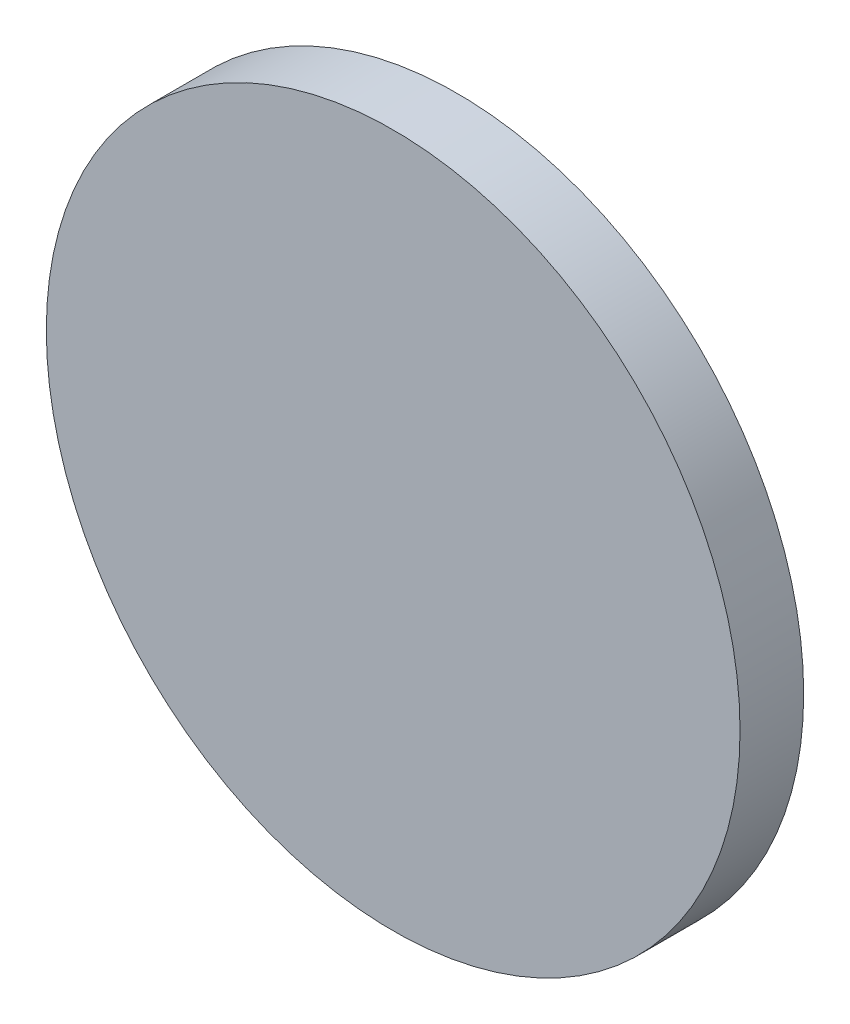
ISO-10303-21;
HEADER;
FILE_DESCRIPTION(('STEP AP214'),'2;1');
FILE_NAME('part.step','',(''),(''),'','','');
FILE_SCHEMA(('AUTOMOTIVE_DESIGN { 1 0 10303 214 1 1 1 1 }'));
ENDSEC;
DATA;
#1=APPLICATION_CONTEXT('core data for automotive mechanical design processes');
#2=APPLICATION_PROTOCOL_DEFINITION('international standard','automotive_design',2000,#1);
#3=PRODUCT_CONTEXT('',#1,'mechanical');
#4=PRODUCT('Part','Part','',(#3));
#5=PRODUCT_RELATED_PRODUCT_CATEGORY('part','',(#4));
#6=PRODUCT_DEFINITION_FORMATION('','',#4);
#7=PRODUCT_DEFINITION_CONTEXT('part definition',#1,'design');
#8=PRODUCT_DEFINITION('design','',#6,#7);
#9=PRODUCT_DEFINITION_SHAPE('','',#8);
#10=(LENGTH_UNIT() NAMED_UNIT(*) SI_UNIT(.MILLI.,.METRE.));
#11=(NAMED_UNIT(*) PLANE_ANGLE_UNIT() SI_UNIT($,.RADIAN.));
#12=(NAMED_UNIT(*) SI_UNIT($,.STERADIAN.) SOLID_ANGLE_UNIT());
#13=UNCERTAINTY_MEASURE_WITH_UNIT(LENGTH_MEASURE(1.E-05),#10,'distance_accuracy_value','');
#14=(GEOMETRIC_REPRESENTATION_CONTEXT(3) GLOBAL_UNCERTAINTY_ASSIGNED_CONTEXT((#13)) GLOBAL_UNIT_ASSIGNED_CONTEXT((#10,
#11,#12)) REPRESENTATION_CONTEXT('',''));
#15=CARTESIAN_POINT('',(0.,0.,0.));
#16=DIRECTION('',(0.,0.,1.));
#17=DIRECTION('',(1.,0.,0.));
#18=AXIS2_PLACEMENT_3D('',#15,#16,#17);
#19=CARTESIAN_POINT('',(0.,0.,50.));
#20=DIRECTION('',(0.,0.,-1.));
#21=DIRECTION('',(-1.,0.,0.));
#22=AXIS2_PLACEMENT_3D('',#19,#20,#21);
#23=CYLINDRICAL_SURFACE('',#22,272.5);
#24=CARTESIAN_POINT('',(0.,0.,50.));
#25=DIRECTION('',(0.,0.,1.));
#26=DIRECTION('',(1.,0.,0.));
#27=AXIS2_PLACEMENT_3D('',#24,#25,#26);
#28=CIRCLE('',#27,272.5);
#29=CARTESIAN_POINT('',(272.5,0.,50.));
#30=VERTEX_POINT('',#29);
#31=EDGE_CURVE('E10',#30,#30,#28,.T.);
#32=ORIENTED_EDGE('',*,*,#31,.F.);
#33=EDGE_LOOP('',(#32));
#34=FACE_BOUND('',#33,.T.);
#35=CARTESIAN_POINT('',(0.,0.,0.));
#36=DIRECTION('',(0.,0.,1.));
#37=DIRECTION('',(1.,0.,0.));
#38=AXIS2_PLACEMENT_3D('',#35,#36,#37);
#39=CIRCLE('',#38,272.5);
#40=CARTESIAN_POINT('',(272.5,0.,0.));
#41=VERTEX_POINT('',#40);
#42=EDGE_CURVE('E38',#41,#41,#39,.T.);
#43=ORIENTED_EDGE('',*,*,#42,.T.);
#44=EDGE_LOOP('',(#43));
#45=FACE_BOUND('',#44,.T.);
#46=ADVANCED_FACE('F35',(#34,#45),#23,.T.);
#47=CARTESIAN_POINT('',(0.,0.,50.));
#48=DIRECTION('',(0.,0.,1.));
#49=DIRECTION('',(1.,0.,0.));
#50=AXIS2_PLACEMENT_3D('',#47,#48,#49);
#51=PLANE('',#50);
#52=ORIENTED_EDGE('',*,*,#31,.T.);
#53=EDGE_LOOP('',(#52));
#54=FACE_BOUND('',#53,.T.);
#55=ADVANCED_FACE('F50',(#54),#51,.T.);
#56=CARTESIAN_POINT('',(0.,0.,0.));
#57=DIRECTION('',(0.,0.,1.));
#58=DIRECTION('',(1.,0.,0.));
#59=AXIS2_PLACEMENT_3D('',#56,#57,#58);
#60=PLANE('',#59);
#61=ORIENTED_EDGE('',*,*,#42,.F.);
#62=EDGE_LOOP('',(#61));
#63=FACE_BOUND('',#62,.T.);
#64=ADVANCED_FACE('F48',(#63),#60,.F.);
#65=CLOSED_SHELL('',(#46,#55,#64));
#66=MANIFOLD_SOLID_BREP('B2',#65);
#67=ADVANCED_BREP_SHAPE_REPRESENTATION('',(#18,#66),#14);
#68=SHAPE_DEFINITION_REPRESENTATION(#9,#67);
ENDSEC;
END-ISO-10303-21;
